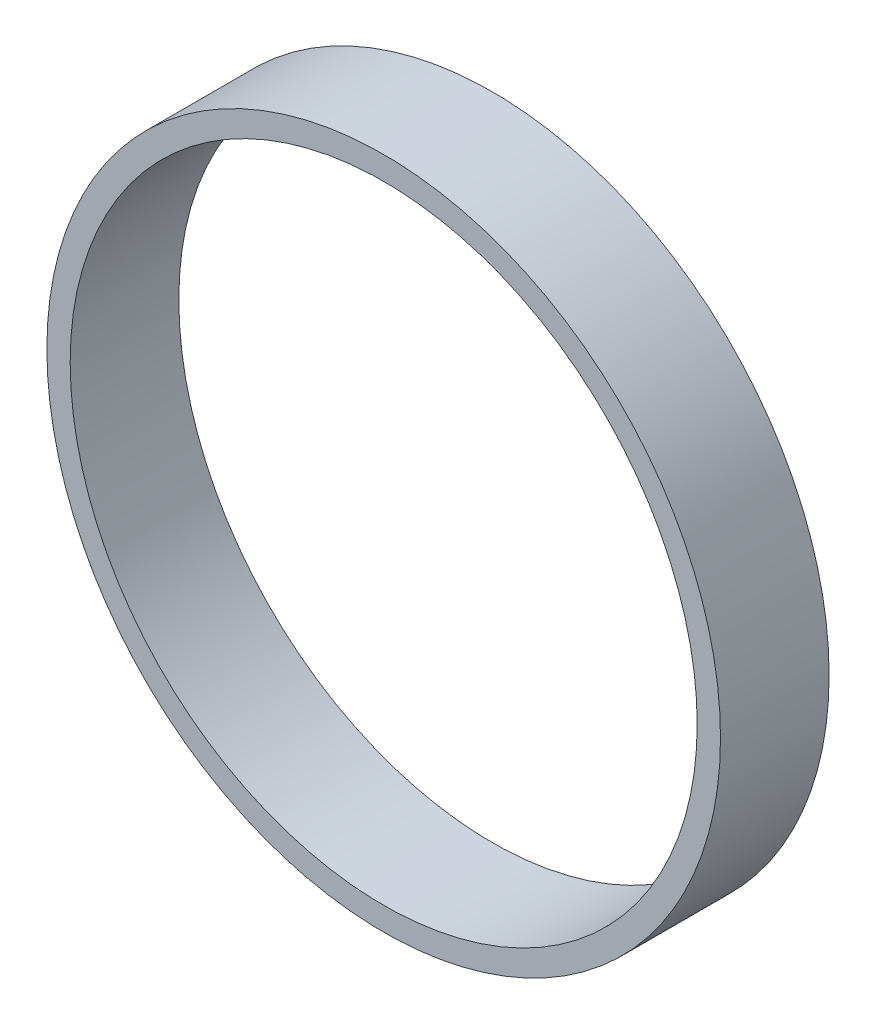
ISO-10303-21;
HEADER;
FILE_DESCRIPTION(('STEP AP214'),'2;1');
FILE_NAME('part.step','',(''),(''),'','','');
FILE_SCHEMA(('AUTOMOTIVE_DESIGN { 1 0 10303 214 1 1 1 1 }'));
ENDSEC;
DATA;
#1=APPLICATION_CONTEXT('core data for automotive mechanical design processes');
#2=APPLICATION_PROTOCOL_DEFINITION('international standard','automotive_design',2000,#1);
#3=PRODUCT_CONTEXT('',#1,'mechanical');
#4=PRODUCT('Part','Part','',(#3));
#5=PRODUCT_RELATED_PRODUCT_CATEGORY('part','',(#4));
#6=PRODUCT_DEFINITION_FORMATION('','',#4);
#7=PRODUCT_DEFINITION_CONTEXT('part definition',#1,'design');
#8=PRODUCT_DEFINITION('design','',#6,#7);
#9=PRODUCT_DEFINITION_SHAPE('','',#8);
#10=(LENGTH_UNIT() NAMED_UNIT(*) SI_UNIT(.MILLI.,.METRE.));
#11=(NAMED_UNIT(*) PLANE_ANGLE_UNIT() SI_UNIT($,.RADIAN.));
#12=(NAMED_UNIT(*) SI_UNIT($,.STERADIAN.) SOLID_ANGLE_UNIT());
#13=UNCERTAINTY_MEASURE_WITH_UNIT(LENGTH_MEASURE(1.E-05),#10,'distance_accuracy_value','');
#14=(GEOMETRIC_REPRESENTATION_CONTEXT(3) GLOBAL_UNCERTAINTY_ASSIGNED_CONTEXT((#13)) GLOBAL_UNIT_ASSIGNED_CONTEXT((#10,
#11,#12)) REPRESENTATION_CONTEXT('',''));
#15=CARTESIAN_POINT('',(0.,0.,0.));
#16=DIRECTION('',(0.,0.,1.));
#17=DIRECTION('',(1.,0.,0.));
#18=AXIS2_PLACEMENT_3D('',#15,#16,#17);
#19=CARTESIAN_POINT('',(0.,0.,11.));
#20=DIRECTION('',(0.,0.,1.));
#21=DIRECTION('',(1.,0.,0.));
#22=AXIS2_PLACEMENT_3D('',#19,#20,#21);
#23=PLANE('',#22);
#24=CARTESIAN_POINT('',(0.,0.,11.));
#25=DIRECTION('',(0.,0.,1.));
#26=DIRECTION('',(1.,0.,0.));
#27=AXIS2_PLACEMENT_3D('',#24,#25,#26);
#28=CIRCLE('',#27,34.11);
#29=CARTESIAN_POINT('',(34.11,0.,11.));
#30=VERTEX_POINT('',#29);
#31=EDGE_CURVE('E10',#30,#30,#28,.T.);
#32=ORIENTED_EDGE('',*,*,#31,.T.);
#33=EDGE_LOOP('',(#32));
#34=FACE_BOUND('',#33,.T.);
#35=CARTESIAN_POINT('',(0.,0.,11.));
#36=DIRECTION('',(0.,0.,1.));
#37=DIRECTION('',(1.,0.,0.));
#38=AXIS2_PLACEMENT_3D('',#35,#36,#37);
#39=CIRCLE('',#38,31.75);
#40=CARTESIAN_POINT('',(31.75,0.,11.));
#41=VERTEX_POINT('',#40);
#42=EDGE_CURVE('E56',#41,#41,#39,.T.);
#43=ORIENTED_EDGE('',*,*,#42,.F.);
#44=EDGE_LOOP('',(#43));
#45=FACE_BOUND('',#44,.T.);
#46=ADVANCED_FACE('F43',(#34,#45),#23,.T.);
#47=CARTESIAN_POINT('',(0.,0.,0.));
#48=DIRECTION('',(0.,0.,1.));
#49=DIRECTION('',(1.,0.,0.));
#50=AXIS2_PLACEMENT_3D('',#47,#48,#49);
#51=PLANE('',#50);
#52=CARTESIAN_POINT('',(0.,0.,0.));
#53=DIRECTION('',(0.,0.,1.));
#54=DIRECTION('',(1.,0.,0.));
#55=AXIS2_PLACEMENT_3D('',#52,#53,#54);
#56=CIRCLE('',#55,34.11);
#57=CARTESIAN_POINT('',(34.11,0.,0.));
#58=VERTEX_POINT('',#57);
#59=EDGE_CURVE('E47',#58,#58,#56,.T.);
#60=ORIENTED_EDGE('',*,*,#59,.F.);
#61=EDGE_LOOP('',(#60));
#62=FACE_BOUND('',#61,.T.);
#63=CARTESIAN_POINT('',(0.,0.,0.));
#64=DIRECTION('',(0.,0.,1.));
#65=DIRECTION('',(1.,0.,0.));
#66=AXIS2_PLACEMENT_3D('',#63,#64,#65);
#67=CIRCLE('',#66,31.75);
#68=CARTESIAN_POINT('',(31.75,0.,0.));
#69=VERTEX_POINT('',#68);
#70=EDGE_CURVE('E58',#69,#69,#67,.T.);
#71=ORIENTED_EDGE('',*,*,#70,.T.);
#72=EDGE_LOOP('',(#71));
#73=FACE_BOUND('',#72,.T.);
#74=ADVANCED_FACE('F70',(#62,#73),#51,.F.);
#75=CARTESIAN_POINT('',(0.,0.,11.));
#76=DIRECTION('',(0.,0.,-1.));
#77=DIRECTION('',(-1.,0.,0.));
#78=AXIS2_PLACEMENT_3D('',#75,#76,#77);
#79=CYLINDRICAL_SURFACE('',#78,34.11);
#80=ORIENTED_EDGE('',*,*,#31,.F.);
#81=EDGE_LOOP('',(#80));
#82=FACE_BOUND('',#81,.T.);
#83=ORIENTED_EDGE('',*,*,#59,.T.);
#84=EDGE_LOOP('',(#83));
#85=FACE_BOUND('',#84,.T.);
#86=ADVANCED_FACE('F45',(#82,#85),#79,.T.);
#87=CARTESIAN_POINT('',(0.,0.,11.));
#88=DIRECTION('',(0.,0.,-1.));
#89=DIRECTION('',(-1.,0.,0.));
#90=AXIS2_PLACEMENT_3D('',#87,#88,#89);
#91=CYLINDRICAL_SURFACE('',#90,31.75);
#92=ORIENTED_EDGE('',*,*,#42,.T.);
#93=EDGE_LOOP('',(#92));
#94=FACE_BOUND('',#93,.T.);
#95=ORIENTED_EDGE('',*,*,#70,.F.);
#96=EDGE_LOOP('',(#95));
#97=FACE_BOUND('',#96,.T.);
#98=ADVANCED_FACE('F66',(#94,#97),#91,.F.);
#99=CLOSED_SHELL('',(#46,#74,#86,#98));
#100=MANIFOLD_SOLID_BREP('B2',#99);
#101=ADVANCED_BREP_SHAPE_REPRESENTATION('',(#18,#100),#14);
#102=SHAPE_DEFINITION_REPRESENTATION(#9,#101);
ENDSEC;
END-ISO-10303-21;
